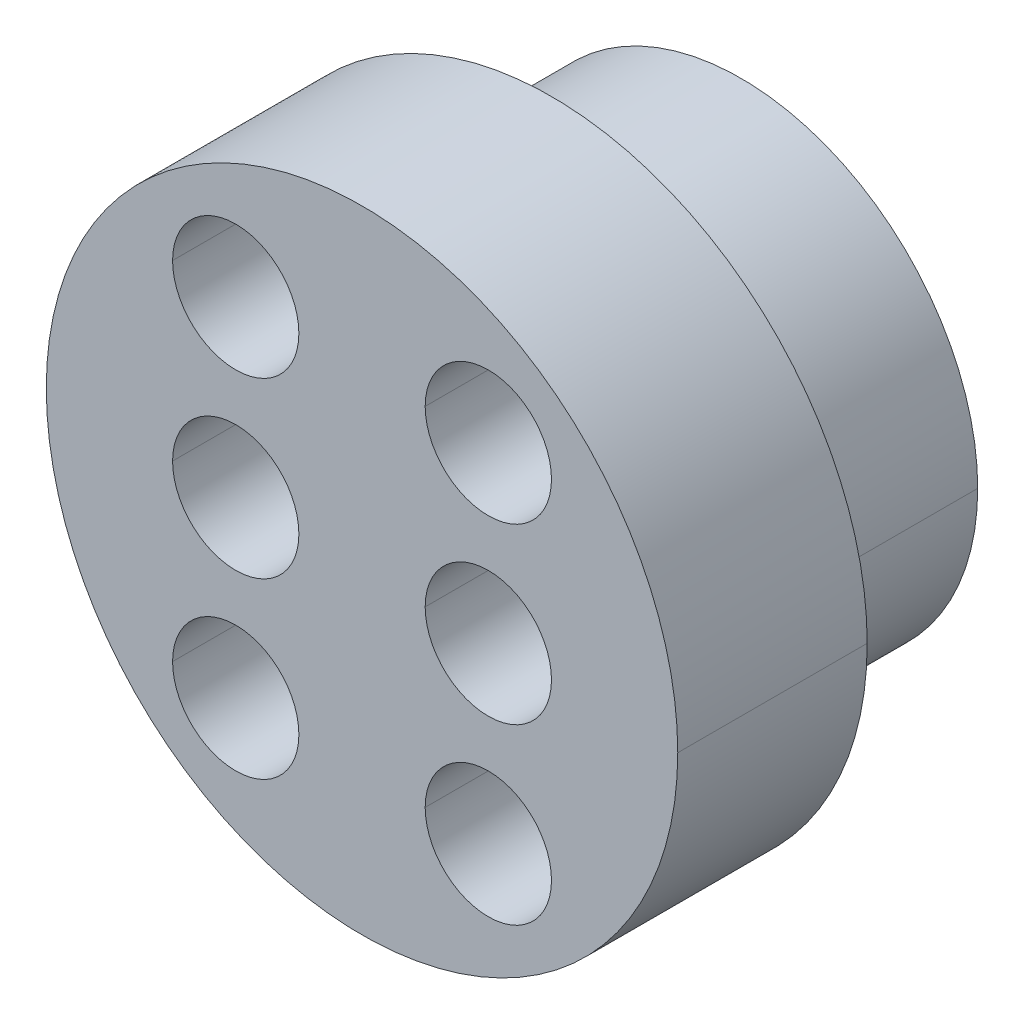
ISO-10303-21;
HEADER;
FILE_DESCRIPTION(('STEP AP214'),'2;1');
FILE_NAME('part.step','',(''),(''),'','','');
FILE_SCHEMA(('AUTOMOTIVE_DESIGN { 1 0 10303 214 1 1 1 1 }'));
ENDSEC;
DATA;
#1=APPLICATION_CONTEXT('core data for automotive mechanical design processes');
#2=APPLICATION_PROTOCOL_DEFINITION('international standard','automotive_design',2000,#1);
#3=PRODUCT_CONTEXT('',#1,'mechanical');
#4=PRODUCT('Part','Part','',(#3));
#5=PRODUCT_RELATED_PRODUCT_CATEGORY('part','',(#4));
#6=PRODUCT_DEFINITION_FORMATION('','',#4);
#7=PRODUCT_DEFINITION_CONTEXT('part definition',#1,'design');
#8=PRODUCT_DEFINITION('design','',#6,#7);
#9=PRODUCT_DEFINITION_SHAPE('','',#8);
#10=(LENGTH_UNIT() NAMED_UNIT(*) SI_UNIT(.MILLI.,.METRE.));
#11=(NAMED_UNIT(*) PLANE_ANGLE_UNIT() SI_UNIT($,.RADIAN.));
#12=(NAMED_UNIT(*) SI_UNIT($,.STERADIAN.) SOLID_ANGLE_UNIT());
#13=UNCERTAINTY_MEASURE_WITH_UNIT(LENGTH_MEASURE(1.E-05),#10,'distance_accuracy_value','');
#14=(GEOMETRIC_REPRESENTATION_CONTEXT(3) GLOBAL_UNCERTAINTY_ASSIGNED_CONTEXT((#13)) GLOBAL_UNIT_ASSIGNED_CONTEXT((#10,
#11,#12)) REPRESENTATION_CONTEXT('',''));
#15=CARTESIAN_POINT('',(0.,0.,0.));
#16=DIRECTION('',(0.,0.,1.));
#17=DIRECTION('',(1.,0.,0.));
#18=AXIS2_PLACEMENT_3D('',#15,#16,#17);
#19=CARTESIAN_POINT('',(4.,0.,-0.700000000000023));
#20=DIRECTION('',(0.,0.,1.));
#21=DIRECTION('',(1.,0.,0.));
#22=AXIS2_PLACEMENT_3D('',#19,#20,#21);
#23=CONICAL_SURFACE('',#22,1.35,0.785398163397443);
#24=DIRECTION('',(-0.707106781186544,0.,0.707106781186551));
#25=VECTOR('',#24,1.);
#26=CARTESIAN_POINT('',(2.65,0.,-0.700000000000023));
#27=LINE('',#26,#25);
#28=CARTESIAN_POINT('',(2.65,0.,-0.700000000000023));
#29=VERTEX_POINT('',#28);
#30=CARTESIAN_POINT('',(2.,0.,-0.0500000000000163));
#31=VERTEX_POINT('',#30);
#32=EDGE_CURVE('E370',#29,#31,#27,.T.);
#33=ORIENTED_EDGE('',*,*,#32,.F.);
#34=CARTESIAN_POINT('',(4.,0.,-0.700000000000023));
#35=DIRECTION('',(0.,0.,1.));
#36=DIRECTION('',(1.,0.,0.));
#37=AXIS2_PLACEMENT_3D('',#34,#35,#36);
#38=CIRCLE('',#37,1.35);
#39=CARTESIAN_POINT('',(5.35,0.,-0.700000000000023));
#40=VERTEX_POINT('',#39);
#41=EDGE_CURVE('E197',#40,#29,#38,.T.);
#42=ORIENTED_EDGE('',*,*,#41,.F.);
#43=DIRECTION('',(0.707106781186544,0.,0.707106781186551));
#44=VECTOR('',#43,1.);
#45=CARTESIAN_POINT('',(5.35,0.,-0.700000000000023));
#46=LINE('',#45,#44);
#47=CARTESIAN_POINT('',(6.,0.,-0.0500000000000163));
#48=VERTEX_POINT('',#47);
#49=EDGE_CURVE('E388',#40,#48,#46,.T.);
#50=ORIENTED_EDGE('',*,*,#49,.T.);
#51=CARTESIAN_POINT('',(4.,0.,-0.0500000000000163));
#52=DIRECTION('',(0.,0.,-1.));
#53=DIRECTION('',(1.,0.,0.));
#54=AXIS2_PLACEMENT_3D('',#51,#52,#53);
#55=CIRCLE('',#54,2.);
#56=EDGE_CURVE('E224',#31,#48,#55,.T.);
#57=ORIENTED_EDGE('',*,*,#56,.F.);
#58=EDGE_LOOP('',(#33,#42,#50,#57));
#59=FACE_BOUND('',#58,.T.);
#60=ADVANCED_FACE('F16',(#59),#23,.F.);
#61=CARTESIAN_POINT('',(-4.,0.,-0.700000000000023));
#62=DIRECTION('',(0.,0.,1.));
#63=DIRECTION('',(1.,0.,0.));
#64=AXIS2_PLACEMENT_3D('',#61,#62,#63);
#65=CONICAL_SURFACE('',#64,1.35,0.785398163397443);
#66=DIRECTION('',(-0.707106781186544,0.,0.707106781186551));
#67=VECTOR('',#66,1.);
#68=CARTESIAN_POINT('',(-5.35,0.,-0.700000000000023));
#69=LINE('',#68,#67);
#70=CARTESIAN_POINT('',(-5.35,0.,-0.700000000000023));
#71=VERTEX_POINT('',#70);
#72=CARTESIAN_POINT('',(-6.,0.,-0.0500000000000164));
#73=VERTEX_POINT('',#72);
#74=EDGE_CURVE('E410',#71,#73,#69,.T.);
#75=ORIENTED_EDGE('',*,*,#74,.F.);
#76=CARTESIAN_POINT('',(-4.,0.,-0.700000000000023));
#77=DIRECTION('',(0.,0.,1.));
#78=DIRECTION('',(1.,0.,0.));
#79=AXIS2_PLACEMENT_3D('',#76,#77,#78);
#80=CIRCLE('',#79,1.35);
#81=CARTESIAN_POINT('',(-2.65,0.,-0.700000000000023));
#82=VERTEX_POINT('',#81);
#83=EDGE_CURVE('E203',#82,#71,#80,.T.);
#84=ORIENTED_EDGE('',*,*,#83,.F.);
#85=DIRECTION('',(0.707106781186544,0.,0.707106781186551));
#86=VECTOR('',#85,1.);
#87=CARTESIAN_POINT('',(-2.65,0.,-0.700000000000023));
#88=LINE('',#87,#86);
#89=CARTESIAN_POINT('',(-2.,0.,-0.0500000000000164));
#90=VERTEX_POINT('',#89);
#91=EDGE_CURVE('E421',#82,#90,#88,.T.);
#92=ORIENTED_EDGE('',*,*,#91,.T.);
#93=CARTESIAN_POINT('',(-4.,0.,-0.0500000000000164));
#94=DIRECTION('',(0.,0.,-1.));
#95=DIRECTION('',(1.,0.,0.));
#96=AXIS2_PLACEMENT_3D('',#93,#94,#95);
#97=CIRCLE('',#96,2.);
#98=EDGE_CURVE('E220',#73,#90,#97,.T.);
#99=ORIENTED_EDGE('',*,*,#98,.F.);
#100=EDGE_LOOP('',(#75,#84,#92,#99));
#101=FACE_BOUND('',#100,.T.);
#102=ADVANCED_FACE('F356',(#101),#65,.F.);
#103=CARTESIAN_POINT('',(4.,-5.5,0.6));
#104=DIRECTION('',(0.,0.,1.));
#105=DIRECTION('',(1.,0.,0.));
#106=AXIS2_PLACEMENT_3D('',#103,#104,#105);
#107=PLANE('',#106);
#108=CARTESIAN_POINT('',(4.,-5.5,0.6));
#109=DIRECTION('',(0.,0.,1.));
#110=DIRECTION('',(1.,0.,0.));
#111=AXIS2_PLACEMENT_3D('',#108,#109,#110);
#112=CIRCLE('',#111,2.);
#113=CARTESIAN_POINT('',(6.,-5.5,0.6));
#114=VERTEX_POINT('',#113);
#115=CARTESIAN_POINT('',(2.,-5.5,0.6));
#116=VERTEX_POINT('',#115);
#117=EDGE_CURVE('E10',#114,#116,#112,.T.);
#118=ORIENTED_EDGE('',*,*,#117,.T.);
#119=CARTESIAN_POINT('',(4.,-5.5,0.6));
#120=DIRECTION('',(0.,0.,1.));
#121=DIRECTION('',(1.,0.,0.));
#122=AXIS2_PLACEMENT_3D('',#119,#120,#121);
#123=CIRCLE('',#122,2.);
#124=EDGE_CURVE('E400',#116,#114,#123,.T.);
#125=ORIENTED_EDGE('',*,*,#124,.T.);
#126=EDGE_LOOP('',(#118,#125));
#127=FACE_BOUND('',#126,.T.);
#128=ADVANCED_FACE('F362',(#127),#107,.T.);
#129=CARTESIAN_POINT('',(4.,-5.5,0.6));
#130=DIRECTION('',(0.,0.,1.));
#131=DIRECTION('',(1.,0.,0.));
#132=AXIS2_PLACEMENT_3D('',#129,#130,#131);
#133=CYLINDRICAL_SURFACE('',#132,2.);
#134=DIRECTION('',(0.,0.,1.));
#135=VECTOR('',#134,1.);
#136=CARTESIAN_POINT('',(2.,-5.5,0.6));
#137=LINE('',#136,#135);
#138=CARTESIAN_POINT('',(2.,-5.5,6.));
#139=VERTEX_POINT('',#138);
#140=EDGE_CURVE('E396',#116,#139,#137,.T.);
#141=ORIENTED_EDGE('',*,*,#140,.F.);
#142=ORIENTED_EDGE('',*,*,#117,.F.);
#143=DIRECTION('',(0.,0.,1.));
#144=VECTOR('',#143,1.);
#145=CARTESIAN_POINT('',(6.,-5.5,0.6));
#146=LINE('',#145,#144);
#147=CARTESIAN_POINT('',(6.,-5.5,6.));
#148=VERTEX_POINT('',#147);
#149=EDGE_CURVE('E439',#114,#148,#146,.T.);
#150=ORIENTED_EDGE('',*,*,#149,.T.);
#151=CARTESIAN_POINT('',(4.,-5.5,6.));
#152=DIRECTION('',(0.,0.,1.));
#153=DIRECTION('',(1.,0.,0.));
#154=AXIS2_PLACEMENT_3D('',#151,#152,#153);
#155=CIRCLE('',#154,2.);
#156=EDGE_CURVE('E147',#148,#139,#155,.T.);
#157=ORIENTED_EDGE('',*,*,#156,.T.);
#158=EDGE_LOOP('',(#141,#142,#150,#157));
#159=FACE_BOUND('',#158,.T.);
#160=ADVANCED_FACE('F880',(#159),#133,.F.);
#161=CARTESIAN_POINT('',(-4.,-5.5,0.6));
#162=DIRECTION('',(0.,0.,1.));
#163=DIRECTION('',(1.,0.,0.));
#164=AXIS2_PLACEMENT_3D('',#161,#162,#163);
#165=PLANE('',#164);
#166=CARTESIAN_POINT('',(-4.,-5.5,0.6));
#167=DIRECTION('',(0.,0.,1.));
#168=DIRECTION('',(1.,0.,0.));
#169=AXIS2_PLACEMENT_3D('',#166,#167,#168);
#170=CIRCLE('',#169,2.);
#171=CARTESIAN_POINT('',(-2.,-5.5,0.6));
#172=VERTEX_POINT('',#171);
#173=CARTESIAN_POINT('',(-6.,-5.5,0.6));
#174=VERTEX_POINT('',#173);
#175=EDGE_CURVE('E25',#172,#174,#170,.T.);
#176=ORIENTED_EDGE('',*,*,#175,.T.);
#177=CARTESIAN_POINT('',(-4.,-5.5,0.6));
#178=DIRECTION('',(0.,0.,1.));
#179=DIRECTION('',(1.,0.,0.));
#180=AXIS2_PLACEMENT_3D('',#177,#178,#179);
#181=CIRCLE('',#180,2.);
#182=EDGE_CURVE('E440',#174,#172,#181,.T.);
#183=ORIENTED_EDGE('',*,*,#182,.T.);
#184=EDGE_LOOP('',(#176,#183));
#185=FACE_BOUND('',#184,.T.);
#186=ADVANCED_FACE('F872',(#185),#165,.T.);
#187=CARTESIAN_POINT('',(-4.,-5.5,0.6));
#188=DIRECTION('',(0.,0.,1.));
#189=DIRECTION('',(1.,0.,0.));
#190=AXIS2_PLACEMENT_3D('',#187,#188,#189);
#191=CYLINDRICAL_SURFACE('',#190,2.);
#192=DIRECTION('',(0.,0.,1.));
#193=VECTOR('',#192,1.);
#194=CARTESIAN_POINT('',(-6.,-5.5,0.6));
#195=LINE('',#194,#193);
#196=CARTESIAN_POINT('',(-6.,-5.5,6.));
#197=VERTEX_POINT('',#196);
#198=EDGE_CURVE('E263',#174,#197,#195,.T.);
#199=ORIENTED_EDGE('',*,*,#198,.F.);
#200=ORIENTED_EDGE('',*,*,#175,.F.);
#201=DIRECTION('',(0.,0.,1.));
#202=VECTOR('',#201,1.);
#203=CARTESIAN_POINT('',(-2.,-5.5,0.6));
#204=LINE('',#203,#202);
#205=CARTESIAN_POINT('',(-2.,-5.5,6.));
#206=VERTEX_POINT('',#205);
#207=EDGE_CURVE('E253',#172,#206,#204,.T.);
#208=ORIENTED_EDGE('',*,*,#207,.T.);
#209=CARTESIAN_POINT('',(-4.,-5.5,6.));
#210=DIRECTION('',(0.,0.,1.));
#211=DIRECTION('',(1.,0.,0.));
#212=AXIS2_PLACEMENT_3D('',#209,#210,#211);
#213=CIRCLE('',#212,2.);
#214=EDGE_CURVE('E207',#206,#197,#213,.T.);
#215=ORIENTED_EDGE('',*,*,#214,.T.);
#216=EDGE_LOOP('',(#199,#200,#208,#215));
#217=FACE_BOUND('',#216,.T.);
#218=ADVANCED_FACE('F864',(#217),#191,.F.);
#219=CARTESIAN_POINT('',(-4.,5.5,0.6));
#220=DIRECTION('',(0.,0.,1.));
#221=DIRECTION('',(1.,0.,0.));
#222=AXIS2_PLACEMENT_3D('',#219,#220,#221);
#223=PLANE('',#222);
#224=CARTESIAN_POINT('',(-4.,5.5,0.6));
#225=DIRECTION('',(0.,0.,1.));
#226=DIRECTION('',(1.,0.,0.));
#227=AXIS2_PLACEMENT_3D('',#224,#225,#226);
#228=CIRCLE('',#227,2.);
#229=CARTESIAN_POINT('',(-2.,5.5,0.6));
#230=VERTEX_POINT('',#229);
#231=CARTESIAN_POINT('',(-6.,5.5,0.6));
#232=VERTEX_POINT('',#231);
#233=EDGE_CURVE('E176',#230,#232,#228,.T.);
#234=ORIENTED_EDGE('',*,*,#233,.T.);
#235=CARTESIAN_POINT('',(-4.,5.5,0.6));
#236=DIRECTION('',(0.,0.,1.));
#237=DIRECTION('',(1.,0.,0.));
#238=AXIS2_PLACEMENT_3D('',#235,#236,#237);
#239=CIRCLE('',#238,2.);
#240=EDGE_CURVE('E236',#232,#230,#239,.T.);
#241=ORIENTED_EDGE('',*,*,#240,.T.);
#242=EDGE_LOOP('',(#234,#241));
#243=FACE_BOUND('',#242,.T.);
#244=ADVANCED_FACE('F234',(#243),#223,.T.);
#245=CARTESIAN_POINT('',(-4.,5.5,0.6));
#246=DIRECTION('',(0.,0.,1.));
#247=DIRECTION('',(1.,0.,0.));
#248=AXIS2_PLACEMENT_3D('',#245,#246,#247);
#249=CYLINDRICAL_SURFACE('',#248,2.);
#250=DIRECTION('',(0.,0.,1.));
#251=VECTOR('',#250,1.);
#252=CARTESIAN_POINT('',(-6.,5.5,0.6));
#253=LINE('',#252,#251);
#254=CARTESIAN_POINT('',(-6.,5.5,6.));
#255=VERTEX_POINT('',#254);
#256=EDGE_CURVE('E242',#232,#255,#253,.T.);
#257=ORIENTED_EDGE('',*,*,#256,.F.);
#258=ORIENTED_EDGE('',*,*,#233,.F.);
#259=DIRECTION('',(0.,0.,1.));
#260=VECTOR('',#259,1.);
#261=CARTESIAN_POINT('',(-2.,5.5,0.6));
#262=LINE('',#261,#260);
#263=CARTESIAN_POINT('',(-2.,5.5,6.));
#264=VERTEX_POINT('',#263);
#265=EDGE_CURVE('E251',#230,#264,#262,.T.);
#266=ORIENTED_EDGE('',*,*,#265,.T.);
#267=CARTESIAN_POINT('',(-4.,5.5,6.));
#268=DIRECTION('',(0.,0.,1.));
#269=DIRECTION('',(1.,0.,0.));
#270=AXIS2_PLACEMENT_3D('',#267,#268,#269);
#271=CIRCLE('',#270,2.);
#272=EDGE_CURVE('E211',#264,#255,#271,.T.);
#273=ORIENTED_EDGE('',*,*,#272,.T.);
#274=EDGE_LOOP('',(#257,#258,#266,#273));
#275=FACE_BOUND('',#274,.T.);
#276=ADVANCED_FACE('F243',(#275),#249,.F.);
#277=CARTESIAN_POINT('',(4.,5.5,0.6));
#278=DIRECTION('',(0.,0.,1.));
#279=DIRECTION('',(1.,0.,0.));
#280=AXIS2_PLACEMENT_3D('',#277,#278,#279);
#281=PLANE('',#280);
#282=CARTESIAN_POINT('',(4.,5.5,0.6));
#283=DIRECTION('',(0.,0.,1.));
#284=DIRECTION('',(1.,0.,0.));
#285=AXIS2_PLACEMENT_3D('',#282,#283,#284);
#286=CIRCLE('',#285,2.);
#287=CARTESIAN_POINT('',(6.,5.5,0.6));
#288=VERTEX_POINT('',#287);
#289=CARTESIAN_POINT('',(2.,5.5,0.6));
#290=VERTEX_POINT('',#289);
#291=EDGE_CURVE('E225',#288,#290,#286,.T.);
#292=ORIENTED_EDGE('',*,*,#291,.T.);
#293=CARTESIAN_POINT('',(4.,5.5,0.6));
#294=DIRECTION('',(0.,0.,1.));
#295=DIRECTION('',(1.,0.,0.));
#296=AXIS2_PLACEMENT_3D('',#293,#294,#295);
#297=CIRCLE('',#296,2.);
#298=EDGE_CURVE('E277',#290,#288,#297,.T.);
#299=ORIENTED_EDGE('',*,*,#298,.T.);
#300=EDGE_LOOP('',(#292,#299));
#301=FACE_BOUND('',#300,.T.);
#302=ADVANCED_FACE('F559',(#301),#281,.T.);
#303=CARTESIAN_POINT('',(4.,5.5,0.6));
#304=DIRECTION('',(0.,0.,1.));
#305=DIRECTION('',(1.,0.,0.));
#306=AXIS2_PLACEMENT_3D('',#303,#304,#305);
#307=CYLINDRICAL_SURFACE('',#306,2.);
#308=DIRECTION('',(0.,0.,1.));
#309=VECTOR('',#308,1.);
#310=CARTESIAN_POINT('',(2.,5.5,0.6));
#311=LINE('',#310,#309);
#312=CARTESIAN_POINT('',(2.,5.5,6.));
#313=VERTEX_POINT('',#312);
#314=EDGE_CURVE('E281',#290,#313,#311,.T.);
#315=ORIENTED_EDGE('',*,*,#314,.F.);
#316=ORIENTED_EDGE('',*,*,#291,.F.);
#317=DIRECTION('',(0.,0.,1.));
#318=VECTOR('',#317,1.);
#319=CARTESIAN_POINT('',(6.,5.5,0.6));
#320=LINE('',#319,#318);
#321=CARTESIAN_POINT('',(6.,5.5,6.));
#322=VERTEX_POINT('',#321);
#323=EDGE_CURVE('E269',#288,#322,#320,.T.);
#324=ORIENTED_EDGE('',*,*,#323,.T.);
#325=CARTESIAN_POINT('',(4.,5.5,6.));
#326=DIRECTION('',(0.,0.,1.));
#327=DIRECTION('',(1.,0.,0.));
#328=AXIS2_PLACEMENT_3D('',#325,#326,#327);
#329=CIRCLE('',#328,2.);
#330=EDGE_CURVE('E216',#322,#313,#329,.T.);
#331=ORIENTED_EDGE('',*,*,#330,.T.);
#332=EDGE_LOOP('',(#315,#316,#324,#331));
#333=FACE_BOUND('',#332,.T.);
#334=ADVANCED_FACE('F840',(#333),#307,.F.);
#335=CARTESIAN_POINT('',(4.,0.,0.6));
#336=DIRECTION('',(0.,0.,1.));
#337=DIRECTION('',(1.,0.,0.));
#338=AXIS2_PLACEMENT_3D('',#335,#336,#337);
#339=CYLINDRICAL_SURFACE('',#338,2.);
#340=DIRECTION('',(0.,0.,1.));
#341=VECTOR('',#340,1.);
#342=CARTESIAN_POINT('',(2.,0.,0.6));
#343=LINE('',#342,#341);
#344=CARTESIAN_POINT('',(2.,0.,6.));
#345=VERTEX_POINT('',#344);
#346=EDGE_CURVE('E265',#31,#345,#343,.T.);
#347=ORIENTED_EDGE('',*,*,#346,.F.);
#348=ORIENTED_EDGE('',*,*,#56,.T.);
#349=DIRECTION('',(0.,0.,1.));
#350=VECTOR('',#349,1.);
#351=CARTESIAN_POINT('',(6.,0.,0.6));
#352=LINE('',#351,#350);
#353=CARTESIAN_POINT('',(6.,0.,6.));
#354=VERTEX_POINT('',#353);
#355=EDGE_CURVE('E292',#48,#354,#352,.T.);
#356=ORIENTED_EDGE('',*,*,#355,.T.);
#357=CARTESIAN_POINT('',(4.,0.,6.));
#358=DIRECTION('',(0.,0.,1.));
#359=DIRECTION('',(1.,0.,0.));
#360=AXIS2_PLACEMENT_3D('',#357,#358,#359);
#361=CIRCLE('',#360,2.);
#362=EDGE_CURVE('E208',#354,#345,#361,.T.);
#363=ORIENTED_EDGE('',*,*,#362,.T.);
#364=EDGE_LOOP('',(#347,#348,#356,#363));
#365=FACE_BOUND('',#364,.T.);
#366=ADVANCED_FACE('F461',(#365),#339,.F.);
#367=CARTESIAN_POINT('',(-4.,0.,0.6));
#368=DIRECTION('',(0.,0.,1.));
#369=DIRECTION('',(1.,0.,0.));
#370=AXIS2_PLACEMENT_3D('',#367,#368,#369);
#371=CYLINDRICAL_SURFACE('',#370,2.);
#372=DIRECTION('',(0.,0.,1.));
#373=VECTOR('',#372,1.);
#374=CARTESIAN_POINT('',(-6.,0.,0.6));
#375=LINE('',#374,#373);
#376=CARTESIAN_POINT('',(-6.,0.,6.));
#377=VERTEX_POINT('',#376);
#378=EDGE_CURVE('E296',#73,#377,#375,.T.);
#379=ORIENTED_EDGE('',*,*,#378,.F.);
#380=ORIENTED_EDGE('',*,*,#98,.T.);
#381=DIRECTION('',(0.,0.,1.));
#382=VECTOR('',#381,1.);
#383=CARTESIAN_POINT('',(-2.,0.,0.6));
#384=LINE('',#383,#382);
#385=CARTESIAN_POINT('',(-2.,0.,6.));
#386=VERTEX_POINT('',#385);
#387=EDGE_CURVE('E304',#90,#386,#384,.T.);
#388=ORIENTED_EDGE('',*,*,#387,.T.);
#389=CARTESIAN_POINT('',(-4.,0.,6.));
#390=DIRECTION('',(0.,0.,1.));
#391=DIRECTION('',(1.,0.,0.));
#392=AXIS2_PLACEMENT_3D('',#389,#390,#391);
#393=CIRCLE('',#392,2.);
#394=EDGE_CURVE('E172',#386,#377,#393,.T.);
#395=ORIENTED_EDGE('',*,*,#394,.T.);
#396=EDGE_LOOP('',(#379,#380,#388,#395));
#397=FACE_BOUND('',#396,.T.);
#398=ADVANCED_FACE('F353',(#397),#371,.F.);
#399=CARTESIAN_POINT('',(0.,0.,-6.));
#400=DIRECTION('',(0.,0.,1.));
#401=DIRECTION('',(1.,0.,0.));
#402=AXIS2_PLACEMENT_3D('',#399,#400,#401);
#403=CYLINDRICAL_SURFACE('',#402,7.5);
#404=DIRECTION('',(0.,0.,1.));
#405=VECTOR('',#404,1.);
#406=CARTESIAN_POINT('',(-7.5,0.,-6.));
#407=LINE('',#406,#405);
#408=CARTESIAN_POINT('',(-7.5,0.,-6.));
#409=VERTEX_POINT('',#408);
#410=CARTESIAN_POINT('',(-7.5,0.,0.));
#411=VERTEX_POINT('',#410);
#412=EDGE_CURVE('E314',#409,#411,#407,.T.);
#413=ORIENTED_EDGE('',*,*,#412,.F.);
#414=CARTESIAN_POINT('',(0.,0.,-6.));
#415=DIRECTION('',(0.,0.,-1.));
#416=DIRECTION('',(-1.,0.,0.));
#417=AXIS2_PLACEMENT_3D('',#414,#415,#416);
#418=CIRCLE('',#417,7.5);
#419=CARTESIAN_POINT('',(7.5,0.,-6.));
#420=VERTEX_POINT('',#419);
#421=EDGE_CURVE('E217',#420,#409,#418,.T.);
#422=ORIENTED_EDGE('',*,*,#421,.F.);
#423=DIRECTION('',(0.,0.,1.));
#424=VECTOR('',#423,1.);
#425=CARTESIAN_POINT('',(7.5,0.,-6.));
#426=LINE('',#425,#424);
#427=CARTESIAN_POINT('',(7.5,0.,0.));
#428=VERTEX_POINT('',#427);
#429=EDGE_CURVE('E159',#420,#428,#426,.T.);
#430=ORIENTED_EDGE('',*,*,#429,.T.);
#431=CARTESIAN_POINT('',(0.,0.,0.));
#432=DIRECTION('',(0.,0.,-1.));
#433=DIRECTION('',(-1.,0.,0.));
#434=AXIS2_PLACEMENT_3D('',#431,#432,#433);
#435=CIRCLE('',#434,7.5);
#436=EDGE_CURVE('E215',#428,#411,#435,.T.);
#437=ORIENTED_EDGE('',*,*,#436,.T.);
#438=EDGE_LOOP('',(#413,#422,#430,#437));
#439=FACE_BOUND('',#438,.T.);
#440=ADVANCED_FACE('F339',(#439),#403,.T.);
#441=CARTESIAN_POINT('',(0.,0.,-6.));
#442=DIRECTION('',(0.,0.,-1.));
#443=DIRECTION('',(0.,-1.,0.));
#444=AXIS2_PLACEMENT_3D('',#441,#442,#443);
#445=PLANE('',#444);
#446=CARTESIAN_POINT('',(-4.,0.,-6.));
#447=DIRECTION('',(0.,0.,-1.));
#448=DIRECTION('',(-1.,0.,0.));
#449=AXIS2_PLACEMENT_3D('',#446,#447,#448);
#450=CIRCLE('',#449,1.35);
#451=CARTESIAN_POINT('',(-5.35,0.,-6.));
#452=VERTEX_POINT('',#451);
#453=CARTESIAN_POINT('',(-2.65,0.,-6.));
#454=VERTEX_POINT('',#453);
#455=EDGE_CURVE('E59',#452,#454,#450,.T.);
#456=ORIENTED_EDGE('',*,*,#455,.F.);
#457=CARTESIAN_POINT('',(-4.,0.,-6.));
#458=DIRECTION('',(0.,0.,-1.));
#459=DIRECTION('',(-1.,0.,0.));
#460=AXIS2_PLACEMENT_3D('',#457,#458,#459);
#461=CIRCLE('',#460,1.35);
#462=EDGE_CURVE('E183',#454,#452,#461,.T.);
#463=ORIENTED_EDGE('',*,*,#462,.F.);
#464=EDGE_LOOP('',(#456,#463));
#465=FACE_BOUND('',#464,.T.);
#466=CARTESIAN_POINT('',(4.,0.,-6.));
#467=DIRECTION('',(0.,0.,-1.));
#468=DIRECTION('',(-1.,0.,0.));
#469=AXIS2_PLACEMENT_3D('',#466,#467,#468);
#470=CIRCLE('',#469,1.35);
#471=CARTESIAN_POINT('',(2.65,0.,-6.));
#472=VERTEX_POINT('',#471);
#473=CARTESIAN_POINT('',(5.35,0.,-6.));
#474=VERTEX_POINT('',#473);
#475=EDGE_CURVE('E37',#472,#474,#470,.T.);
#476=ORIENTED_EDGE('',*,*,#475,.F.);
#477=CARTESIAN_POINT('',(4.,0.,-6.));
#478=DIRECTION('',(0.,0.,-1.));
#479=DIRECTION('',(-1.,0.,0.));
#480=AXIS2_PLACEMENT_3D('',#477,#478,#479);
#481=CIRCLE('',#480,1.35);
#482=EDGE_CURVE('E192',#474,#472,#481,.T.);
#483=ORIENTED_EDGE('',*,*,#482,.F.);
#484=EDGE_LOOP('',(#476,#483));
#485=FACE_BOUND('',#484,.T.);
#486=ORIENTED_EDGE('',*,*,#421,.T.);
#487=CARTESIAN_POINT('',(0.,0.,-6.));
#488=DIRECTION('',(0.,0.,-1.));
#489=DIRECTION('',(-1.,0.,0.));
#490=AXIS2_PLACEMENT_3D('',#487,#488,#489);
#491=CIRCLE('',#490,7.5);
#492=EDGE_CURVE('E309',#409,#420,#491,.T.);
#493=ORIENTED_EDGE('',*,*,#492,.T.);
#494=EDGE_LOOP('',(#486,#493));
#495=FACE_BOUND('',#494,.T.);
#496=ADVANCED_FACE('F343',(#465,#485,#495),#445,.T.);
#497=CARTESIAN_POINT('',(0.,0.,6.));
#498=DIRECTION('',(0.,0.,-1.));
#499=DIRECTION('',(-1.,0.,0.));
#500=AXIS2_PLACEMENT_3D('',#497,#498,#499);
#501=CYLINDRICAL_SURFACE('',#500,10.);
#502=DIRECTION('',(0.,0.,-1.));
#503=VECTOR('',#502,1.);
#504=CARTESIAN_POINT('',(10.,0.,6.));
#505=LINE('',#504,#503);
#506=CARTESIAN_POINT('',(10.,0.,6.));
#507=VERTEX_POINT('',#506);
#508=CARTESIAN_POINT('',(10.,0.,0.));
#509=VERTEX_POINT('',#508);
#510=EDGE_CURVE('E144',#507,#509,#505,.T.);
#511=ORIENTED_EDGE('',*,*,#510,.F.);
#512=CARTESIAN_POINT('',(0.,0.,6.));
#513=DIRECTION('',(0.,0.,1.));
#514=DIRECTION('',(1.,0.,0.));
#515=AXIS2_PLACEMENT_3D('',#512,#513,#514);
#516=CIRCLE('',#515,10.);
#517=CARTESIAN_POINT('',(-10.,0.,6.));
#518=VERTEX_POINT('',#517);
#519=EDGE_CURVE('E133',#518,#507,#516,.T.);
#520=ORIENTED_EDGE('',*,*,#519,.F.);
#521=DIRECTION('',(0.,0.,-1.));
#522=VECTOR('',#521,1.);
#523=CARTESIAN_POINT('',(-10.,0.,6.));
#524=LINE('',#523,#522);
#525=CARTESIAN_POINT('',(-10.,0.,0.));
#526=VERTEX_POINT('',#525);
#527=EDGE_CURVE('E141',#518,#526,#524,.T.);
#528=ORIENTED_EDGE('',*,*,#527,.T.);
#529=CARTESIAN_POINT('',(0.,0.,0.));
#530=DIRECTION('',(0.,0.,1.));
#531=DIRECTION('',(1.,0.,0.));
#532=AXIS2_PLACEMENT_3D('',#529,#530,#531);
#533=CIRCLE('',#532,10.);
#534=EDGE_CURVE('E212',#526,#509,#533,.T.);
#535=ORIENTED_EDGE('',*,*,#534,.T.);
#536=EDGE_LOOP('',(#511,#520,#528,#535));
#537=FACE_BOUND('',#536,.T.);
#538=ADVANCED_FACE('F140',(#537),#501,.T.);
#539=CARTESIAN_POINT('',(0.,0.,0.));
#540=DIRECTION('',(0.,0.,1.));
#541=DIRECTION('',(1.,0.,0.));
#542=AXIS2_PLACEMENT_3D('',#539,#540,#541);
#543=PLANE('',#542);
#544=ORIENTED_EDGE('',*,*,#436,.F.);
#545=CARTESIAN_POINT('',(0.,0.,0.));
#546=DIRECTION('',(0.,0.,-1.));
#547=DIRECTION('',(-1.,0.,0.));
#548=AXIS2_PLACEMENT_3D('',#545,#546,#547);
#549=CIRCLE('',#548,7.5);
#550=EDGE_CURVE('E168',#411,#428,#549,.T.);
#551=ORIENTED_EDGE('',*,*,#550,.F.);
#552=EDGE_LOOP('',(#544,#551));
#553=FACE_BOUND('',#552,.T.);
#554=ORIENTED_EDGE('',*,*,#534,.F.);
#555=CARTESIAN_POINT('',(0.,0.,0.));
#556=DIRECTION('',(0.,0.,1.));
#557=DIRECTION('',(1.,0.,0.));
#558=AXIS2_PLACEMENT_3D('',#555,#556,#557);
#559=CIRCLE('',#558,10.);
#560=EDGE_CURVE('E153',#509,#526,#559,.T.);
#561=ORIENTED_EDGE('',*,*,#560,.F.);
#562=EDGE_LOOP('',(#554,#561));
#563=FACE_BOUND('',#562,.T.);
#564=ADVANCED_FACE('F333',(#553,#563),#543,.F.);
#565=CARTESIAN_POINT('',(0.,0.,6.));
#566=DIRECTION('',(0.,0.,1.));
#567=DIRECTION('',(1.,0.,0.));
#568=AXIS2_PLACEMENT_3D('',#565,#566,#567);
#569=PLANE('',#568);
#570=ORIENTED_EDGE('',*,*,#330,.F.);
#571=CARTESIAN_POINT('',(4.,5.5,6.));
#572=DIRECTION('',(0.,0.,1.));
#573=DIRECTION('',(1.,0.,0.));
#574=AXIS2_PLACEMENT_3D('',#571,#572,#573);
#575=CIRCLE('',#574,2.);
#576=EDGE_CURVE('E285',#313,#322,#575,.T.);
#577=ORIENTED_EDGE('',*,*,#576,.F.);
#578=EDGE_LOOP('',(#570,#577));
#579=FACE_BOUND('',#578,.T.);
#580=ORIENTED_EDGE('',*,*,#394,.F.);
#581=CARTESIAN_POINT('',(-4.,0.,6.));
#582=DIRECTION('',(0.,0.,1.));
#583=DIRECTION('',(1.,0.,0.));
#584=AXIS2_PLACEMENT_3D('',#581,#582,#583);
#585=CIRCLE('',#584,2.);
#586=EDGE_CURVE('E300',#377,#386,#585,.T.);
#587=ORIENTED_EDGE('',*,*,#586,.F.);
#588=EDGE_LOOP('',(#580,#587));
#589=FACE_BOUND('',#588,.T.);
#590=ORIENTED_EDGE('',*,*,#362,.F.);
#591=CARTESIAN_POINT('',(4.,0.,6.));
#592=DIRECTION('',(0.,0.,1.));
#593=DIRECTION('',(1.,0.,0.));
#594=AXIS2_PLACEMENT_3D('',#591,#592,#593);
#595=CIRCLE('',#594,2.);
#596=EDGE_CURVE('E268',#345,#354,#595,.T.);
#597=ORIENTED_EDGE('',*,*,#596,.F.);
#598=EDGE_LOOP('',(#590,#597));
#599=FACE_BOUND('',#598,.T.);
#600=ORIENTED_EDGE('',*,*,#272,.F.);
#601=CARTESIAN_POINT('',(-4.,5.5,6.));
#602=DIRECTION('',(0.,0.,1.));
#603=DIRECTION('',(1.,0.,0.));
#604=AXIS2_PLACEMENT_3D('',#601,#602,#603);
#605=CIRCLE('',#604,2.);
#606=EDGE_CURVE('E248',#255,#264,#605,.T.);
#607=ORIENTED_EDGE('',*,*,#606,.F.);
#608=EDGE_LOOP('',(#600,#607));
#609=FACE_BOUND('',#608,.T.);
#610=ORIENTED_EDGE('',*,*,#214,.F.);
#611=CARTESIAN_POINT('',(-4.,-5.5,6.));
#612=DIRECTION('',(0.,0.,1.));
#613=DIRECTION('',(1.,0.,0.));
#614=AXIS2_PLACEMENT_3D('',#611,#612,#613);
#615=CIRCLE('',#614,2.);
#616=EDGE_CURVE('E259',#197,#206,#615,.T.);
#617=ORIENTED_EDGE('',*,*,#616,.F.);
#618=EDGE_LOOP('',(#610,#617));
#619=FACE_BOUND('',#618,.T.);
#620=ORIENTED_EDGE('',*,*,#156,.F.);
#621=CARTESIAN_POINT('',(4.,-5.5,6.));
#622=DIRECTION('',(0.,0.,1.));
#623=DIRECTION('',(1.,0.,0.));
#624=AXIS2_PLACEMENT_3D('',#621,#622,#623);
#625=CIRCLE('',#624,2.);
#626=EDGE_CURVE('E399',#139,#148,#625,.T.);
#627=ORIENTED_EDGE('',*,*,#626,.F.);
#628=EDGE_LOOP('',(#620,#627));
#629=FACE_BOUND('',#628,.T.);
#630=ORIENTED_EDGE('',*,*,#519,.T.);
#631=CARTESIAN_POINT('',(0.,0.,6.));
#632=DIRECTION('',(0.,0.,1.));
#633=DIRECTION('',(1.,0.,0.));
#634=AXIS2_PLACEMENT_3D('',#631,#632,#633);
#635=CIRCLE('',#634,10.);
#636=EDGE_CURVE('E151',#507,#518,#635,.T.);
#637=ORIENTED_EDGE('',*,*,#636,.T.);
#638=EDGE_LOOP('',(#630,#637));
#639=FACE_BOUND('',#638,.T.);
#640=ADVANCED_FACE('F157',(#579,#589,#599,#609,#619,#629,#639),#569,.T.);
#641=CARTESIAN_POINT('',(-4.,0.,6.));
#642=DIRECTION('',(0.,0.,-1.));
#643=DIRECTION('',(-1.,0.,0.));
#644=AXIS2_PLACEMENT_3D('',#641,#642,#643);
#645=CYLINDRICAL_SURFACE('',#644,1.35);
#646=DIRECTION('',(0.,0.,-1.));
#647=VECTOR('',#646,1.);
#648=CARTESIAN_POINT('',(-2.65,0.,6.));
#649=LINE('',#648,#647);
#650=EDGE_CURVE('E155',#82,#454,#649,.T.);
#651=ORIENTED_EDGE('',*,*,#650,.F.);
#652=ORIENTED_EDGE('',*,*,#83,.T.);
#653=DIRECTION('',(0.,0.,-1.));
#654=VECTOR('',#653,1.);
#655=CARTESIAN_POINT('',(-5.35,0.,6.));
#656=LINE('',#655,#654);
#657=EDGE_CURVE('E187',#71,#452,#656,.T.);
#658=ORIENTED_EDGE('',*,*,#657,.T.);
#659=ORIENTED_EDGE('',*,*,#455,.T.);
#660=EDGE_LOOP('',(#651,#652,#658,#659));
#661=FACE_BOUND('',#660,.T.);
#662=ADVANCED_FACE('F540',(#661),#645,.F.);
#663=CARTESIAN_POINT('',(4.,0.,6.));
#664=DIRECTION('',(0.,0.,-1.));
#665=DIRECTION('',(-1.,0.,0.));
#666=AXIS2_PLACEMENT_3D('',#663,#664,#665);
#667=CYLINDRICAL_SURFACE('',#666,1.35);
#668=DIRECTION('',(0.,0.,-1.));
#669=VECTOR('',#668,1.);
#670=CARTESIAN_POINT('',(5.35,0.,6.));
#671=LINE('',#670,#669);
#672=EDGE_CURVE('E188',#40,#474,#671,.T.);
#673=ORIENTED_EDGE('',*,*,#672,.F.);
#674=ORIENTED_EDGE('',*,*,#41,.T.);
#675=DIRECTION('',(0.,0.,-1.));
#676=VECTOR('',#675,1.);
#677=CARTESIAN_POINT('',(2.65,0.,6.));
#678=LINE('',#677,#676);
#679=EDGE_CURVE('E196',#29,#472,#678,.T.);
#680=ORIENTED_EDGE('',*,*,#679,.T.);
#681=ORIENTED_EDGE('',*,*,#475,.T.);
#682=EDGE_LOOP('',(#673,#674,#680,#681));
#683=FACE_BOUND('',#682,.T.);
#684=ADVANCED_FACE('F542',(#683),#667,.F.);
#685=CARTESIAN_POINT('',(4.,0.,6.));
#686=DIRECTION('',(0.,0.,-1.));
#687=DIRECTION('',(-1.,0.,0.));
#688=AXIS2_PLACEMENT_3D('',#685,#686,#687);
#689=CYLINDRICAL_SURFACE('',#688,1.35);
#690=CARTESIAN_POINT('',(4.,0.,-0.700000000000023));
#691=DIRECTION('',(0.,0.,1.));
#692=DIRECTION('',(1.,0.,0.));
#693=AXIS2_PLACEMENT_3D('',#690,#691,#692);
#694=CIRCLE('',#693,1.35);
#695=EDGE_CURVE('E383',#29,#40,#694,.T.);
#696=ORIENTED_EDGE('',*,*,#695,.T.);
#697=ORIENTED_EDGE('',*,*,#672,.T.);
#698=ORIENTED_EDGE('',*,*,#482,.T.);
#699=ORIENTED_EDGE('',*,*,#679,.F.);
#700=EDGE_LOOP('',(#696,#697,#698,#699));
#701=FACE_BOUND('',#700,.T.);
#702=ADVANCED_FACE('F549',(#701),#689,.F.);
#703=CARTESIAN_POINT('',(-4.,0.,6.));
#704=DIRECTION('',(0.,0.,-1.));
#705=DIRECTION('',(-1.,0.,0.));
#706=AXIS2_PLACEMENT_3D('',#703,#704,#705);
#707=CYLINDRICAL_SURFACE('',#706,1.35);
#708=CARTESIAN_POINT('',(-4.,0.,-0.700000000000023));
#709=DIRECTION('',(0.,0.,1.));
#710=DIRECTION('',(1.,0.,0.));
#711=AXIS2_PLACEMENT_3D('',#708,#709,#710);
#712=CIRCLE('',#711,1.35);
#713=EDGE_CURVE('E409',#71,#82,#712,.T.);
#714=ORIENTED_EDGE('',*,*,#713,.T.);
#715=ORIENTED_EDGE('',*,*,#650,.T.);
#716=ORIENTED_EDGE('',*,*,#462,.T.);
#717=ORIENTED_EDGE('',*,*,#657,.F.);
#718=EDGE_LOOP('',(#714,#715,#716,#717));
#719=FACE_BOUND('',#718,.T.);
#720=ADVANCED_FACE('F539',(#719),#707,.F.);
#721=CARTESIAN_POINT('',(0.,0.,6.));
#722=DIRECTION('',(0.,0.,-1.));
#723=DIRECTION('',(-1.,0.,0.));
#724=AXIS2_PLACEMENT_3D('',#721,#722,#723);
#725=CYLINDRICAL_SURFACE('',#724,10.);
#726=ORIENTED_EDGE('',*,*,#636,.F.);
#727=ORIENTED_EDGE('',*,*,#510,.T.);
#728=ORIENTED_EDGE('',*,*,#560,.T.);
#729=ORIENTED_EDGE('',*,*,#527,.F.);
#730=EDGE_LOOP('',(#726,#727,#728,#729));
#731=FACE_BOUND('',#730,.T.);
#732=ADVANCED_FACE('F150',(#731),#725,.T.);
#733=CARTESIAN_POINT('',(0.,0.,-6.));
#734=DIRECTION('',(0.,0.,1.));
#735=DIRECTION('',(1.,0.,0.));
#736=AXIS2_PLACEMENT_3D('',#733,#734,#735);
#737=CYLINDRICAL_SURFACE('',#736,7.5);
#738=ORIENTED_EDGE('',*,*,#492,.F.);
#739=ORIENTED_EDGE('',*,*,#412,.T.);
#740=ORIENTED_EDGE('',*,*,#550,.T.);
#741=ORIENTED_EDGE('',*,*,#429,.F.);
#742=EDGE_LOOP('',(#738,#739,#740,#741));
#743=FACE_BOUND('',#742,.T.);
#744=ADVANCED_FACE('F330',(#743),#737,.T.);
#745=CARTESIAN_POINT('',(-4.,0.,0.6));
#746=DIRECTION('',(0.,0.,1.));
#747=DIRECTION('',(1.,0.,0.));
#748=AXIS2_PLACEMENT_3D('',#745,#746,#747);
#749=CYLINDRICAL_SURFACE('',#748,2.);
#750=CARTESIAN_POINT('',(-4.,0.,-0.0500000000000164));
#751=DIRECTION('',(0.,0.,-1.));
#752=DIRECTION('',(1.,0.,0.));
#753=AXIS2_PLACEMENT_3D('',#750,#751,#752);
#754=CIRCLE('',#753,2.);
#755=EDGE_CURVE('E414',#90,#73,#754,.T.);
#756=ORIENTED_EDGE('',*,*,#755,.T.);
#757=ORIENTED_EDGE('',*,*,#378,.T.);
#758=ORIENTED_EDGE('',*,*,#586,.T.);
#759=ORIENTED_EDGE('',*,*,#387,.F.);
#760=EDGE_LOOP('',(#756,#757,#758,#759));
#761=FACE_BOUND('',#760,.T.);
#762=ADVANCED_FACE('F530',(#761),#749,.F.);
#763=CARTESIAN_POINT('',(4.,0.,0.6));
#764=DIRECTION('',(0.,0.,1.));
#765=DIRECTION('',(1.,0.,0.));
#766=AXIS2_PLACEMENT_3D('',#763,#764,#765);
#767=CYLINDRICAL_SURFACE('',#766,2.);
#768=CARTESIAN_POINT('',(4.,0.,-0.0500000000000163));
#769=DIRECTION('',(0.,0.,-1.));
#770=DIRECTION('',(1.,0.,0.));
#771=AXIS2_PLACEMENT_3D('',#768,#769,#770);
#772=CIRCLE('',#771,2.);
#773=EDGE_CURVE('E382',#48,#31,#772,.T.);
#774=ORIENTED_EDGE('',*,*,#773,.T.);
#775=ORIENTED_EDGE('',*,*,#346,.T.);
#776=ORIENTED_EDGE('',*,*,#596,.T.);
#777=ORIENTED_EDGE('',*,*,#355,.F.);
#778=EDGE_LOOP('',(#774,#775,#776,#777));
#779=FACE_BOUND('',#778,.T.);
#780=ADVANCED_FACE('F456',(#779),#767,.F.);
#781=CARTESIAN_POINT('',(4.,5.5,0.6));
#782=DIRECTION('',(0.,0.,1.));
#783=DIRECTION('',(1.,0.,0.));
#784=AXIS2_PLACEMENT_3D('',#781,#782,#783);
#785=CYLINDRICAL_SURFACE('',#784,2.);
#786=ORIENTED_EDGE('',*,*,#298,.F.);
#787=ORIENTED_EDGE('',*,*,#314,.T.);
#788=ORIENTED_EDGE('',*,*,#576,.T.);
#789=ORIENTED_EDGE('',*,*,#323,.F.);
#790=EDGE_LOOP('',(#786,#787,#788,#789));
#791=FACE_BOUND('',#790,.T.);
#792=ADVANCED_FACE('F573',(#791),#785,.F.);
#793=CARTESIAN_POINT('',(-4.,5.5,0.6));
#794=DIRECTION('',(0.,0.,1.));
#795=DIRECTION('',(1.,0.,0.));
#796=AXIS2_PLACEMENT_3D('',#793,#794,#795);
#797=CYLINDRICAL_SURFACE('',#796,2.);
#798=ORIENTED_EDGE('',*,*,#240,.F.);
#799=ORIENTED_EDGE('',*,*,#256,.T.);
#800=ORIENTED_EDGE('',*,*,#606,.T.);
#801=ORIENTED_EDGE('',*,*,#265,.F.);
#802=EDGE_LOOP('',(#798,#799,#800,#801));
#803=FACE_BOUND('',#802,.T.);
#804=ADVANCED_FACE('F250',(#803),#797,.F.);
#805=CARTESIAN_POINT('',(-4.,-5.5,0.6));
#806=DIRECTION('',(0.,0.,1.));
#807=DIRECTION('',(1.,0.,0.));
#808=AXIS2_PLACEMENT_3D('',#805,#806,#807);
#809=CYLINDRICAL_SURFACE('',#808,2.);
#810=ORIENTED_EDGE('',*,*,#182,.F.);
#811=ORIENTED_EDGE('',*,*,#198,.T.);
#812=ORIENTED_EDGE('',*,*,#616,.T.);
#813=ORIENTED_EDGE('',*,*,#207,.F.);
#814=EDGE_LOOP('',(#810,#811,#812,#813));
#815=FACE_BOUND('',#814,.T.);
#816=ADVANCED_FACE('F569',(#815),#809,.F.);
#817=CARTESIAN_POINT('',(4.,-5.5,0.6));
#818=DIRECTION('',(0.,0.,1.));
#819=DIRECTION('',(1.,0.,0.));
#820=AXIS2_PLACEMENT_3D('',#817,#818,#819);
#821=CYLINDRICAL_SURFACE('',#820,2.);
#822=ORIENTED_EDGE('',*,*,#124,.F.);
#823=ORIENTED_EDGE('',*,*,#140,.T.);
#824=ORIENTED_EDGE('',*,*,#626,.T.);
#825=ORIENTED_EDGE('',*,*,#149,.F.);
#826=EDGE_LOOP('',(#822,#823,#824,#825));
#827=FACE_BOUND('',#826,.T.);
#828=ADVANCED_FACE('F562',(#827),#821,.F.);
#829=CARTESIAN_POINT('',(-4.,0.,-0.700000000000023));
#830=DIRECTION('',(0.,0.,1.));
#831=DIRECTION('',(1.,0.,0.));
#832=AXIS2_PLACEMENT_3D('',#829,#830,#831);
#833=CONICAL_SURFACE('',#832,1.35,0.785398163397443);
#834=ORIENTED_EDGE('',*,*,#713,.F.);
#835=ORIENTED_EDGE('',*,*,#74,.T.);
#836=ORIENTED_EDGE('',*,*,#755,.F.);
#837=ORIENTED_EDGE('',*,*,#91,.F.);
#838=EDGE_LOOP('',(#834,#835,#836,#837));
#839=FACE_BOUND('',#838,.T.);
#840=ADVANCED_FACE('F536',(#839),#833,.F.);
#841=CARTESIAN_POINT('',(4.,0.,-0.700000000000023));
#842=DIRECTION('',(0.,0.,1.));
#843=DIRECTION('',(1.,0.,0.));
#844=AXIS2_PLACEMENT_3D('',#841,#842,#843);
#845=CONICAL_SURFACE('',#844,1.35,0.785398163397443);
#846=ORIENTED_EDGE('',*,*,#695,.F.);
#847=ORIENTED_EDGE('',*,*,#32,.T.);
#848=ORIENTED_EDGE('',*,*,#773,.F.);
#849=ORIENTED_EDGE('',*,*,#49,.F.);
#850=EDGE_LOOP('',(#846,#847,#848,#849));
#851=FACE_BOUND('',#850,.T.);
#852=ADVANCED_FACE('F387',(#851),#845,.F.);
#853=CLOSED_SHELL('',(#60,#102,#128,#160,#186,#218,#244,#276,#302,#334,#366,#398,#440,#496,#538,
#564,#640,#662,#684,#702,#720,#732,#744,#762,#780,#792,#804,#816,#828,#840,#852));
#854=MANIFOLD_SOLID_BREP('B1',#853);
#855=ADVANCED_BREP_SHAPE_REPRESENTATION('',(#18,#854),#14);
#856=SHAPE_DEFINITION_REPRESENTATION(#9,#855);
ENDSEC;
END-ISO-10303-21;
